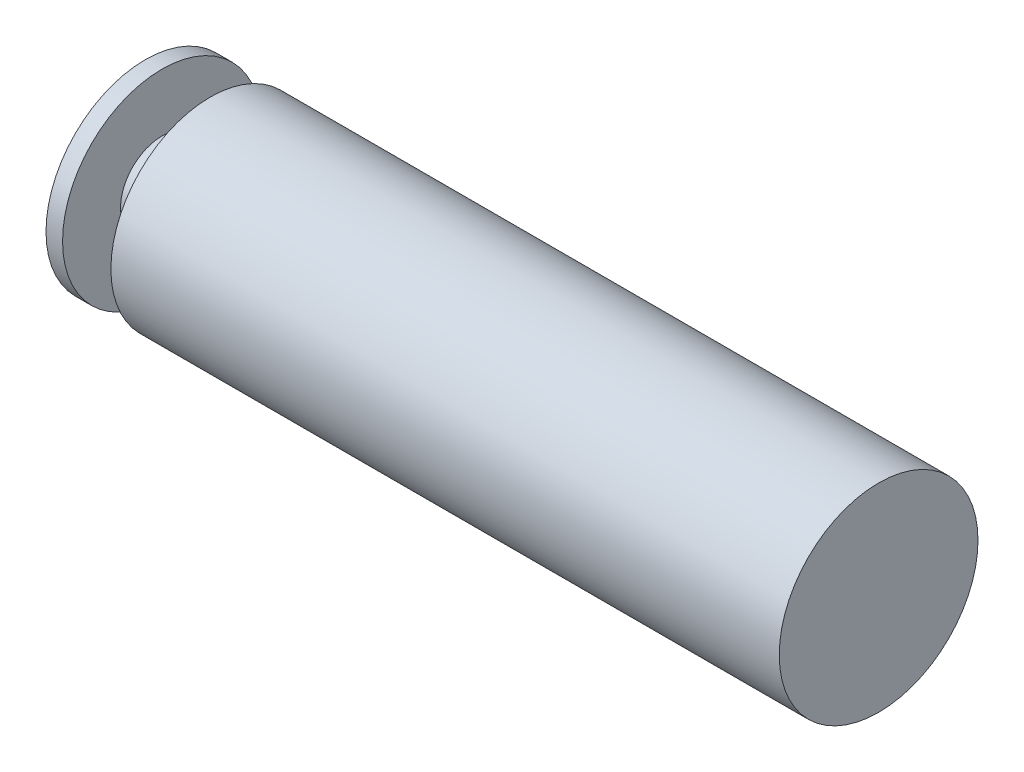
ISO-10303-21;
HEADER;
FILE_DESCRIPTION(('STEP AP214'),'2;1');
FILE_NAME('part.step','',(''),(''),'','','');
FILE_SCHEMA(('AUTOMOTIVE_DESIGN { 1 0 10303 214 1 1 1 1 }'));
ENDSEC;
DATA;
#1=APPLICATION_CONTEXT('core data for automotive mechanical design processes');
#2=APPLICATION_PROTOCOL_DEFINITION('international standard','automotive_design',2000,#1);
#3=PRODUCT_CONTEXT('',#1,'mechanical');
#4=PRODUCT('Part','Part','',(#3));
#5=PRODUCT_RELATED_PRODUCT_CATEGORY('part','',(#4));
#6=PRODUCT_DEFINITION_FORMATION('','',#4);
#7=PRODUCT_DEFINITION_CONTEXT('part definition',#1,'design');
#8=PRODUCT_DEFINITION('design','',#6,#7);
#9=PRODUCT_DEFINITION_SHAPE('','',#8);
#10=(LENGTH_UNIT() NAMED_UNIT(*) SI_UNIT(.MILLI.,.METRE.));
#11=(NAMED_UNIT(*) PLANE_ANGLE_UNIT() SI_UNIT($,.RADIAN.));
#12=(NAMED_UNIT(*) SI_UNIT($,.STERADIAN.) SOLID_ANGLE_UNIT());
#13=UNCERTAINTY_MEASURE_WITH_UNIT(LENGTH_MEASURE(1.E-05),#10,'distance_accuracy_value','');
#14=(GEOMETRIC_REPRESENTATION_CONTEXT(3) GLOBAL_UNCERTAINTY_ASSIGNED_CONTEXT((#13)) GLOBAL_UNIT_ASSIGNED_CONTEXT((#10,
#11,#12)) REPRESENTATION_CONTEXT('',''));
#15=CARTESIAN_POINT('',(0.,0.,0.));
#16=DIRECTION('',(0.,0.,1.));
#17=DIRECTION('',(1.,0.,0.));
#18=AXIS2_PLACEMENT_3D('',#15,#16,#17);
#19=CARTESIAN_POINT('',(0.,0.,0.));
#20=DIRECTION('',(-1.,0.,0.));
#21=DIRECTION('',(0.,0.,1.));
#22=AXIS2_PLACEMENT_3D('',#19,#20,#21);
#23=PLANE('',#22);
#24=CARTESIAN_POINT('',(0.,0.,0.));
#25=DIRECTION('',(1.,0.,0.));
#26=DIRECTION('',(0.,0.,-1.));
#27=AXIS2_PLACEMENT_3D('',#24,#25,#26);
#28=CIRCLE('',#27,12.);
#29=CARTESIAN_POINT('',(0.,0.,-12.));
#30=VERTEX_POINT('',#29);
#31=EDGE_CURVE('E10',#30,#30,#28,.T.);
#32=ORIENTED_EDGE('',*,*,#31,.F.);
#33=EDGE_LOOP('',(#32));
#34=FACE_BOUND('',#33,.T.);
#35=ADVANCED_FACE('F31',(#34),#23,.T.);
#36=CARTESIAN_POINT('',(88.5466363867821,0.,0.));
#37=DIRECTION('',(1.,0.,0.));
#38=DIRECTION('',(0.,0.,-1.));
#39=AXIS2_PLACEMENT_3D('',#36,#37,#38);
#40=CYLINDRICAL_SURFACE('',#39,12.);
#41=ORIENTED_EDGE('',*,*,#31,.T.);
#42=EDGE_LOOP('',(#41));
#43=FACE_BOUND('',#42,.T.);
#44=CARTESIAN_POINT('',(2.,0.,0.));
#45=DIRECTION('',(1.,0.,0.));
#46=DIRECTION('',(0.,0.,-1.));
#47=AXIS2_PLACEMENT_3D('',#44,#45,#46);
#48=CIRCLE('',#47,12.);
#49=CARTESIAN_POINT('',(2.,0.,-12.));
#50=VERTEX_POINT('',#49);
#51=EDGE_CURVE('E37',#50,#50,#48,.T.);
#52=ORIENTED_EDGE('',*,*,#51,.F.);
#53=EDGE_LOOP('',(#52));
#54=FACE_BOUND('',#53,.T.);
#55=ADVANCED_FACE('F73',(#43,#54),#40,.T.);
#56=CARTESIAN_POINT('',(2.,12.,0.));
#57=DIRECTION('',(1.,0.,0.));
#58=DIRECTION('',(0.,0.,-1.));
#59=AXIS2_PLACEMENT_3D('',#56,#57,#58);
#60=PLANE('',#59);
#61=ORIENTED_EDGE('',*,*,#51,.T.);
#62=EDGE_LOOP('',(#61));
#63=FACE_BOUND('',#62,.T.);
#64=CARTESIAN_POINT('',(2.,0.,0.));
#65=DIRECTION('',(1.,0.,0.));
#66=DIRECTION('',(0.,0.,-1.));
#67=AXIS2_PLACEMENT_3D('',#64,#65,#66);
#68=CIRCLE('',#67,5.);
#69=CARTESIAN_POINT('',(2.,0.,-5.));
#70=VERTEX_POINT('',#69);
#71=EDGE_CURVE('E41',#70,#70,#68,.T.);
#72=ORIENTED_EDGE('',*,*,#71,.F.);
#73=EDGE_LOOP('',(#72));
#74=FACE_BOUND('',#73,.T.);
#75=ADVANCED_FACE('F78',(#63,#74),#60,.T.);
#76=CARTESIAN_POINT('',(88.5466363867821,0.,0.));
#77=DIRECTION('',(1.,0.,0.));
#78=DIRECTION('',(0.,0.,-1.));
#79=AXIS2_PLACEMENT_3D('',#76,#77,#78);
#80=CYLINDRICAL_SURFACE('',#79,5.);
#81=ORIENTED_EDGE('',*,*,#71,.T.);
#82=EDGE_LOOP('',(#81));
#83=FACE_BOUND('',#82,.T.);
#84=CARTESIAN_POINT('',(7.83460470022089,0.,0.));
#85=DIRECTION('',(1.,0.,0.));
#86=DIRECTION('',(0.,0.,-1.));
#87=AXIS2_PLACEMENT_3D('',#84,#85,#86);
#88=CIRCLE('',#87,5.);
#89=CARTESIAN_POINT('',(7.83460470022089,0.,-5.));
#90=VERTEX_POINT('',#89);
#91=EDGE_CURVE('E45',#90,#90,#88,.T.);
#92=ORIENTED_EDGE('',*,*,#91,.F.);
#93=EDGE_LOOP('',(#92));
#94=FACE_BOUND('',#93,.T.);
#95=ADVANCED_FACE('F69',(#83,#94),#80,.T.);
#96=CARTESIAN_POINT('',(7.83460470022088,5.,0.));
#97=DIRECTION('',(-1.,0.,0.));
#98=DIRECTION('',(0.,0.,1.));
#99=AXIS2_PLACEMENT_3D('',#96,#97,#98);
#100=PLANE('',#99);
#101=ORIENTED_EDGE('',*,*,#91,.T.);
#102=EDGE_LOOP('',(#101));
#103=FACE_BOUND('',#102,.T.);
#104=CARTESIAN_POINT('',(7.83460470022089,0.,0.));
#105=DIRECTION('',(1.,0.,0.));
#106=DIRECTION('',(0.,0.,-1.));
#107=AXIS2_PLACEMENT_3D('',#104,#105,#106);
#108=CIRCLE('',#107,12.);
#109=CARTESIAN_POINT('',(7.83460470022089,0.,-12.));
#110=VERTEX_POINT('',#109);
#111=EDGE_CURVE('E50',#110,#110,#108,.T.);
#112=ORIENTED_EDGE('',*,*,#111,.F.);
#113=EDGE_LOOP('',(#112));
#114=FACE_BOUND('',#113,.T.);
#115=ADVANCED_FACE('F61',(#103,#114),#100,.T.);
#116=CARTESIAN_POINT('',(88.5466363867821,0.,0.));
#117=DIRECTION('',(1.,0.,0.));
#118=DIRECTION('',(0.,0.,-1.));
#119=AXIS2_PLACEMENT_3D('',#116,#117,#118);
#120=CYLINDRICAL_SURFACE('',#119,12.);
#121=ORIENTED_EDGE('',*,*,#111,.T.);
#122=EDGE_LOOP('',(#121));
#123=FACE_BOUND('',#122,.T.);
#124=CARTESIAN_POINT('',(88.5466363867821,0.,0.));
#125=DIRECTION('',(1.,0.,0.));
#126=DIRECTION('',(0.,0.,-1.));
#127=AXIS2_PLACEMENT_3D('',#124,#125,#126);
#128=CIRCLE('',#127,12.);
#129=CARTESIAN_POINT('',(88.5466363867821,0.,-12.));
#130=VERTEX_POINT('',#129);
#131=EDGE_CURVE('E53',#130,#130,#128,.T.);
#132=ORIENTED_EDGE('',*,*,#131,.F.);
#133=EDGE_LOOP('',(#132));
#134=FACE_BOUND('',#133,.T.);
#135=ADVANCED_FACE('F59',(#123,#134),#120,.T.);
#136=CARTESIAN_POINT('',(88.5466363867821,12.,0.));
#137=DIRECTION('',(1.,0.,0.));
#138=DIRECTION('',(0.,0.,-1.));
#139=AXIS2_PLACEMENT_3D('',#136,#137,#138);
#140=PLANE('',#139);
#141=ORIENTED_EDGE('',*,*,#131,.T.);
#142=EDGE_LOOP('',(#141));
#143=FACE_BOUND('',#142,.T.);
#144=ADVANCED_FACE('F57',(#143),#140,.T.);
#145=CLOSED_SHELL('',(#35,#55,#75,#95,#115,#135,#144));
#146=MANIFOLD_SOLID_BREP('B2',#145);
#147=ADVANCED_BREP_SHAPE_REPRESENTATION('',(#18,#146),#14);
#148=SHAPE_DEFINITION_REPRESENTATION(#9,#147);
ENDSEC;
END-ISO-10303-21;
